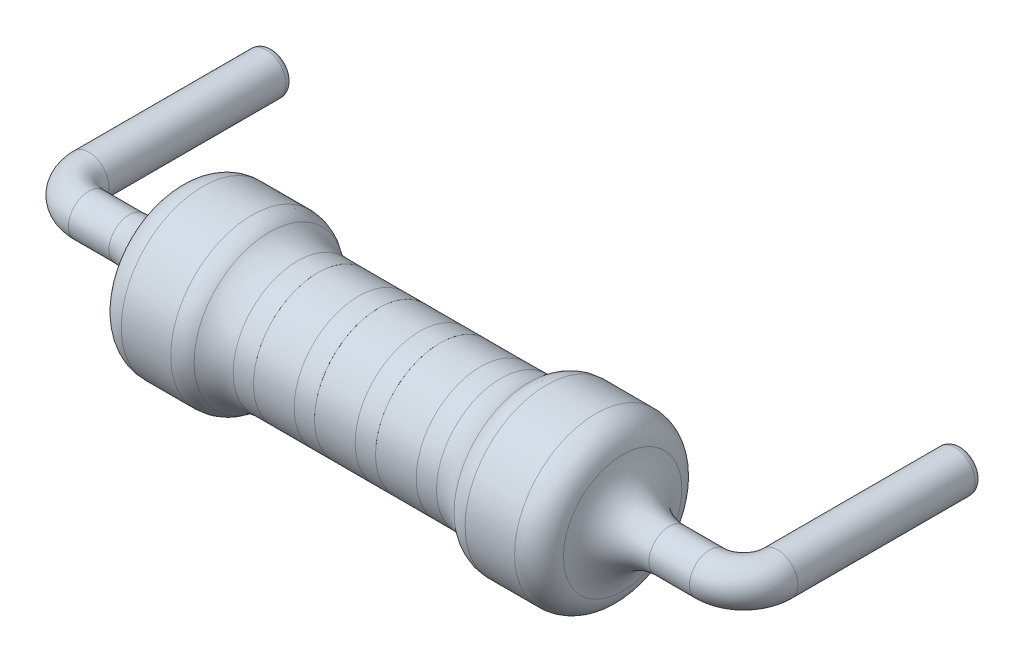
ISO-10303-21;
HEADER;
FILE_DESCRIPTION(('STEP AP214'),'2;1');
FILE_NAME('part.step','',(''),(''),'','','');
FILE_SCHEMA(('AUTOMOTIVE_DESIGN { 1 0 10303 214 1 1 1 1 }'));
ENDSEC;
DATA;
#1=APPLICATION_CONTEXT('core data for automotive mechanical design processes');
#2=APPLICATION_PROTOCOL_DEFINITION('international standard','automotive_design',2000,#1);
#3=PRODUCT_CONTEXT('',#1,'mechanical');
#4=PRODUCT('Part','Part','',(#3));
#5=PRODUCT_RELATED_PRODUCT_CATEGORY('part','',(#4));
#6=PRODUCT_DEFINITION_FORMATION('','',#4);
#7=PRODUCT_DEFINITION_CONTEXT('part definition',#1,'design');
#8=PRODUCT_DEFINITION('design','',#6,#7);
#9=PRODUCT_DEFINITION_SHAPE('','',#8);
#10=(LENGTH_UNIT() NAMED_UNIT(*) SI_UNIT(.MILLI.,.METRE.));
#11=(NAMED_UNIT(*) PLANE_ANGLE_UNIT() SI_UNIT($,.RADIAN.));
#12=(NAMED_UNIT(*) SI_UNIT($,.STERADIAN.) SOLID_ANGLE_UNIT());
#13=UNCERTAINTY_MEASURE_WITH_UNIT(LENGTH_MEASURE(1.E-05),#10,'distance_accuracy_value','');
#14=(GEOMETRIC_REPRESENTATION_CONTEXT(3) GLOBAL_UNCERTAINTY_ASSIGNED_CONTEXT((#13)) GLOBAL_UNIT_ASSIGNED_CONTEXT((#10,
#11,#12)) REPRESENTATION_CONTEXT('',''));
#15=CARTESIAN_POINT('',(0.,0.,0.));
#16=DIRECTION('',(0.,0.,1.));
#17=DIRECTION('',(1.,0.,0.));
#18=AXIS2_PLACEMENT_3D('',#15,#16,#17);
#19=CARTESIAN_POINT('',(5.08,0.,-2.00000000000004));
#20=DIRECTION('',(0.,0.,-1.));
#21=DIRECTION('',(-1.,0.,0.));
#22=AXIS2_PLACEMENT_3D('',#19,#20,#21);
#23=PLANE('',#22);
#24=CARTESIAN_POINT('',(5.08,0.,-2.00000000000004));
#25=DIRECTION('',(0.,0.,1.));
#26=DIRECTION('',(1.,0.,0.));
#27=AXIS2_PLACEMENT_3D('',#24,#25,#26);
#28=CIRCLE('',#27,0.2);
#29=CARTESIAN_POINT('',(5.28,0.,-2.00000000000004));
#30=VERTEX_POINT('',#29);
#31=CARTESIAN_POINT('',(4.88,0.,-2.00000000000003));
#32=VERTEX_POINT('',#31);
#33=EDGE_CURVE('E357',#30,#32,#28,.T.);
#34=ORIENTED_EDGE('',*,*,#33,.F.);
#35=CARTESIAN_POINT('',(5.08,0.,-2.00000000000004));
#36=DIRECTION('',(0.,0.,1.));
#37=DIRECTION('',(-1.,0.,0.));
#38=AXIS2_PLACEMENT_3D('',#35,#36,#37);
#39=CIRCLE('',#38,0.2);
#40=EDGE_CURVE('E367',#32,#30,#39,.T.);
#41=ORIENTED_EDGE('',*,*,#40,.F.);
#42=EDGE_LOOP('',(#34,#41));
#43=FACE_BOUND('',#42,.T.);
#44=ADVANCED_FACE('F17',(#43),#23,.T.);
#45=CARTESIAN_POINT('',(5.08,0.,-1.90000000000004));
#46=DIRECTION('',(0.,0.,-1.));
#47=DIRECTION('',(-1.,0.,0.));
#48=AXIS2_PLACEMENT_3D('',#45,#46,#47);
#49=TOROIDAL_SURFACE('',#48,0.200000000000001,0.1);
#50=ORIENTED_EDGE('',*,*,#40,.T.);
#51=ORIENTED_EDGE('',*,*,#33,.T.);
#52=EDGE_LOOP('',(#50,#51));
#53=FACE_BOUND('',#52,.T.);
#54=CARTESIAN_POINT('',(5.08,0.,-1.90000000000004));
#55=DIRECTION('',(0.,0.,-1.));
#56=DIRECTION('',(-1.,0.,0.));
#57=AXIS2_PLACEMENT_3D('',#54,#55,#56);
#58=CIRCLE('',#57,0.3);
#59=CARTESIAN_POINT('',(4.78,0.,-1.90000000000004));
#60=VERTEX_POINT('',#59);
#61=EDGE_CURVE('E379',#60,#60,#58,.F.);
#62=ORIENTED_EDGE('',*,*,#61,.F.);
#63=EDGE_LOOP('',(#62));
#64=FACE_BOUND('',#63,.T.);
#65=ADVANCED_FACE('F344',(#53,#64),#49,.T.);
#66=CARTESIAN_POINT('',(5.08,0.,0.712999999999925));
#67=DIRECTION('',(0.,0.,-1.));
#68=DIRECTION('',(-1.,0.,0.));
#69=AXIS2_PLACEMENT_3D('',#66,#67,#68);
#70=CYLINDRICAL_SURFACE('',#69,0.3);
#71=ORIENTED_EDGE('',*,*,#61,.T.);
#72=EDGE_LOOP('',(#71));
#73=FACE_BOUND('',#72,.T.);
#74=CARTESIAN_POINT('',(5.08,0.,0.712999999999949));
#75=DIRECTION('',(0.,0.,1.));
#76=DIRECTION('',(1.,0.,0.));
#77=AXIS2_PLACEMENT_3D('',#74,#75,#76);
#78=CIRCLE('',#77,0.3);
#79=CARTESIAN_POINT('',(5.38,0.,0.712999999999922));
#80=VERTEX_POINT('',#79);
#81=EDGE_CURVE('E334',#80,#80,#78,.T.);
#82=ORIENTED_EDGE('',*,*,#81,.F.);
#83=EDGE_LOOP('',(#82));
#84=FACE_BOUND('',#83,.T.);
#85=ADVANCED_FACE('F341',(#73,#84),#70,.T.);
#86=CARTESIAN_POINT('',(4.58,0.,0.712999999999995));
#87=DIRECTION('',(0.,-1.,0.));
#88=DIRECTION('',(0.,0.,-1.));
#89=AXIS2_PLACEMENT_3D('',#86,#87,#88);
#90=TOROIDAL_SURFACE('',#89,0.5,0.3);
#91=ORIENTED_EDGE('',*,*,#81,.T.);
#92=EDGE_LOOP('',(#91));
#93=FACE_BOUND('',#92,.T.);
#94=CARTESIAN_POINT('',(4.57999999999996,0.,1.213));
#95=DIRECTION('',(-1.,0.,0.));
#96=DIRECTION('',(0.,0.,1.));
#97=AXIS2_PLACEMENT_3D('',#94,#95,#96);
#98=CIRCLE('',#97,0.3);
#99=CARTESIAN_POINT('',(4.57999999999996,0.,1.513));
#100=VERTEX_POINT('',#99);
#101=EDGE_CURVE('E330',#100,#100,#98,.T.);
#102=ORIENTED_EDGE('',*,*,#101,.F.);
#103=EDGE_LOOP('',(#102));
#104=FACE_BOUND('',#103,.T.);
#105=ADVANCED_FACE('F338',(#93,#104),#90,.T.);
#106=CARTESIAN_POINT('',(4.58,0.,1.213));
#107=DIRECTION('',(-1.,0.,0.));
#108=DIRECTION('',(0.,0.,1.));
#109=AXIS2_PLACEMENT_3D('',#106,#107,#108);
#110=CYLINDRICAL_SURFACE('',#109,0.3);
#111=CARTESIAN_POINT('',(3.9816653826392,0.,1.213));
#112=DIRECTION('',(1.,0.,0.));
#113=DIRECTION('',(0.,0.,-1.));
#114=AXIS2_PLACEMENT_3D('',#111,#112,#113);
#115=CIRCLE('',#114,0.3);
#116=CARTESIAN_POINT('',(3.9816653826392,0.,0.912999999999996));
#117=VERTEX_POINT('',#116);
#118=EDGE_CURVE('E326',#117,#117,#115,.T.);
#119=ORIENTED_EDGE('',*,*,#118,.T.);
#120=EDGE_LOOP('',(#119));
#121=FACE_BOUND('',#120,.T.);
#122=ORIENTED_EDGE('',*,*,#101,.T.);
#123=EDGE_LOOP('',(#122));
#124=FACE_BOUND('',#123,.T.);
#125=ADVANCED_FACE('F321',(#121,#124),#110,.T.);
#126=CARTESIAN_POINT('',(3.9816653826392,0.,1.213));
#127=DIRECTION('',(1.,0.,0.));
#128=DIRECTION('',(0.,0.,-1.));
#129=AXIS2_PLACEMENT_3D('',#126,#127,#128);
#130=TOROIDAL_SURFACE('',#129,1.,0.7);
#131=CARTESIAN_POINT('',(3.29333286641425,0.,1.213));
#132=DIRECTION('',(1.,0.,0.));
#133=DIRECTION('',(0.,0.,-1.));
#134=AXIS2_PLACEMENT_3D('',#131,#132,#133);
#135=CIRCLE('',#134,0.872727272727279);
#136=CARTESIAN_POINT('',(3.29333286641425,0.,0.340272727272717));
#137=VERTEX_POINT('',#136);
#138=EDGE_CURVE('E308',#137,#137,#135,.F.);
#139=ORIENTED_EDGE('',*,*,#138,.F.);
#140=EDGE_LOOP('',(#139));
#141=FACE_BOUND('',#140,.T.);
#142=ORIENTED_EDGE('',*,*,#118,.F.);
#143=EDGE_LOOP('',(#142));
#144=FACE_BOUND('',#143,.T.);
#145=ADVANCED_FACE('F317',(#141,#144),#130,.F.);
#146=CARTESIAN_POINT('',(2.9,0.,1.213));
#147=DIRECTION('',(1.,0.,0.));
#148=DIRECTION('',(0.,0.,-1.));
#149=AXIS2_PLACEMENT_3D('',#146,#147,#148);
#150=TOROIDAL_SURFACE('',#149,0.8,0.4);
#151=ORIENTED_EDGE('',*,*,#138,.T.);
#152=EDGE_LOOP('',(#151));
#153=FACE_BOUND('',#152,.T.);
#154=CARTESIAN_POINT('',(2.9,0.,1.213));
#155=DIRECTION('',(-1.,0.,0.));
#156=DIRECTION('',(0.,0.,1.));
#157=AXIS2_PLACEMENT_3D('',#154,#155,#156);
#158=CIRCLE('',#157,1.2);
#159=CARTESIAN_POINT('',(2.9,0.,2.413));
#160=VERTEX_POINT('',#159);
#161=EDGE_CURVE('E304',#160,#160,#158,.T.);
#162=ORIENTED_EDGE('',*,*,#161,.F.);
#163=EDGE_LOOP('',(#162));
#164=FACE_BOUND('',#163,.T.);
#165=ADVANCED_FACE('F313',(#153,#164),#150,.T.);
#166=CARTESIAN_POINT('',(3.3,0.,1.213));
#167=DIRECTION('',(-1.,0.,0.));
#168=DIRECTION('',(0.,0.,1.));
#169=AXIS2_PLACEMENT_3D('',#166,#167,#168);
#170=CYLINDRICAL_SURFACE('',#169,1.2);
#171=ORIENTED_EDGE('',*,*,#161,.T.);
#172=EDGE_LOOP('',(#171));
#173=FACE_BOUND('',#172,.T.);
#174=CARTESIAN_POINT('',(2.17080992435478,0.,1.213));
#175=DIRECTION('',(-1.,0.,0.));
#176=DIRECTION('',(0.,0.,1.));
#177=AXIS2_PLACEMENT_3D('',#174,#175,#176);
#178=CIRCLE('',#177,1.2);
#179=CARTESIAN_POINT('',(2.17080992435478,0.,2.413));
#180=VERTEX_POINT('',#179);
#181=EDGE_CURVE('E298',#180,#180,#178,.T.);
#182=ORIENTED_EDGE('',*,*,#181,.F.);
#183=EDGE_LOOP('',(#182));
#184=FACE_BOUND('',#183,.T.);
#185=ADVANCED_FACE('F316',(#173,#184),#170,.T.);
#186=CARTESIAN_POINT('',(2.17080992435478,0.,1.213));
#187=DIRECTION('',(-1.,0.,0.));
#188=DIRECTION('',(0.,0.,1.));
#189=AXIS2_PLACEMENT_3D('',#186,#187,#188);
#190=TOROIDAL_SURFACE('',#189,0.8,0.4);
#191=ORIENTED_EDGE('',*,*,#181,.T.);
#192=EDGE_LOOP('',(#191));
#193=FACE_BOUND('',#192,.T.);
#194=CARTESIAN_POINT('',(1.91691465083171,0.,1.213));
#195=DIRECTION('',(-1.,0.,0.));
#196=DIRECTION('',(0.,0.,1.));
#197=AXIS2_PLACEMENT_3D('',#194,#195,#196);
#198=CIRCLE('',#197,1.10909090909091);
#199=CARTESIAN_POINT('',(1.91691465083171,0.,2.3220909090909));
#200=VERTEX_POINT('',#199);
#201=EDGE_CURVE('E294',#200,#200,#198,.F.);
#202=ORIENTED_EDGE('',*,*,#201,.T.);
#203=EDGE_LOOP('',(#202));
#204=FACE_BOUND('',#203,.T.);
#205=ADVANCED_FACE('F284',(#193,#204),#190,.T.);
#206=CARTESIAN_POINT('',(1.47259792216634,0.,1.213));
#207=DIRECTION('',(-1.,0.,0.));
#208=DIRECTION('',(0.,0.,1.));
#209=AXIS2_PLACEMENT_3D('',#206,#207,#208);
#210=TOROIDAL_SURFACE('',#209,1.65,0.7);
#211=ORIENTED_EDGE('',*,*,#201,.F.);
#212=EDGE_LOOP('',(#211));
#213=FACE_BOUND('',#212,.T.);
#214=CARTESIAN_POINT('',(1.49905071029915,0.,1.213));
#215=DIRECTION('',(-1.,0.,0.));
#216=DIRECTION('',(0.,0.,1.));
#217=AXIS2_PLACEMENT_3D('',#214,#215,#216);
#218=CIRCLE('',#217,0.9505);
#219=CARTESIAN_POINT('',(1.49905071029915,0.,2.1635));
#220=VERTEX_POINT('',#219);
#221=EDGE_CURVE('E297',#220,#220,#218,.T.);
#222=ORIENTED_EDGE('',*,*,#221,.F.);
#223=EDGE_LOOP('',(#222));
#224=FACE_BOUND('',#223,.T.);
#225=ADVANCED_FACE('F279',(#213,#224),#210,.F.);
#226=CARTESIAN_POINT('',(1.5,0.,1.213));
#227=DIRECTION('',(-1.,0.,0.));
#228=DIRECTION('',(0.,0.,1.));
#229=AXIS2_PLACEMENT_3D('',#226,#227,#228);
#230=CYLINDRICAL_SURFACE('',#229,0.9505);
#231=ORIENTED_EDGE('',*,*,#221,.T.);
#232=EDGE_LOOP('',(#231));
#233=FACE_BOUND('',#232,.T.);
#234=CARTESIAN_POINT('',(1.2,0.,1.213));
#235=DIRECTION('',(-1.,0.,0.));
#236=DIRECTION('',(0.,0.,1.));
#237=AXIS2_PLACEMENT_3D('',#234,#235,#236);
#238=CIRCLE('',#237,0.9505);
#239=CARTESIAN_POINT('',(1.2,0.,0.262749999999996));
#240=VERTEX_POINT('',#239);
#241=CARTESIAN_POINT('',(1.2,0.,2.16325));
#242=VERTEX_POINT('',#241);
#243=EDGE_CURVE('E391',#240,#242,#238,.F.);
#244=ORIENTED_EDGE('',*,*,#243,.T.);
#245=CARTESIAN_POINT('',(1.2,0.,1.213));
#246=DIRECTION('',(1.,0.,0.));
#247=DIRECTION('',(0.,0.,1.));
#248=AXIS2_PLACEMENT_3D('',#245,#246,#247);
#249=CIRCLE('',#248,0.9505);
#250=EDGE_CURVE('E487',#242,#240,#249,.T.);
#251=ORIENTED_EDGE('',*,*,#250,.T.);
#252=EDGE_LOOP('',(#244,#251));
#253=FACE_BOUND('',#252,.T.);
#254=ADVANCED_FACE('F270',(#233,#253),#230,.T.);
#255=CARTESIAN_POINT('',(1.2,0.,1.213));
#256=DIRECTION('',(1.,0.,0.));
#257=DIRECTION('',(0.,0.,-1.));
#258=AXIS2_PLACEMENT_3D('',#255,#256,#257);
#259=PLANE('',#258);
#260=ORIENTED_EDGE('',*,*,#243,.F.);
#261=CARTESIAN_POINT('',(1.2,0.,1.213));
#262=DIRECTION('',(-1.,0.,0.));
#263=DIRECTION('',(0.,0.,1.));
#264=AXIS2_PLACEMENT_3D('',#261,#262,#263);
#265=CIRCLE('',#264,0.95);
#266=EDGE_CURVE('E456',#242,#240,#265,.T.);
#267=ORIENTED_EDGE('',*,*,#266,.F.);
#268=EDGE_LOOP('',(#260,#267));
#269=FACE_BOUND('',#268,.T.);
#270=ADVANCED_FACE('F249',(#269),#259,.F.);
#271=CARTESIAN_POINT('',(4.48700576850888,0.,1.213));
#272=DIRECTION('',(-1.,0.,0.));
#273=DIRECTION('',(0.,0.,1.));
#274=AXIS2_PLACEMENT_3D('',#271,#272,#273);
#275=CYLINDRICAL_SURFACE('',#274,0.95);
#276=ORIENTED_EDGE('',*,*,#266,.T.);
#277=ORIENTED_EDGE('',*,*,#250,.F.);
#278=EDGE_LOOP('',(#276,#277));
#279=FACE_BOUND('',#278,.T.);
#280=CARTESIAN_POINT('',(0.6,0.,1.213));
#281=DIRECTION('',(-1.,0.,0.));
#282=DIRECTION('',(0.,0.,1.));
#283=AXIS2_PLACEMENT_3D('',#280,#281,#282);
#284=CIRCLE('',#283,0.95);
#285=CARTESIAN_POINT('',(0.6,0.,2.16325));
#286=VERTEX_POINT('',#285);
#287=CARTESIAN_POINT('',(0.6,0.,0.262749999999996));
#288=VERTEX_POINT('',#287);
#289=EDGE_CURVE('E450',#286,#288,#284,.T.);
#290=ORIENTED_EDGE('',*,*,#289,.F.);
#291=CARTESIAN_POINT('',(0.6,0.,1.213));
#292=DIRECTION('',(1.,0.,0.));
#293=DIRECTION('',(0.,0.,1.));
#294=AXIS2_PLACEMENT_3D('',#291,#292,#293);
#295=CIRCLE('',#294,0.95);
#296=EDGE_CURVE('E264',#286,#288,#295,.T.);
#297=ORIENTED_EDGE('',*,*,#296,.T.);
#298=EDGE_LOOP('',(#290,#297));
#299=FACE_BOUND('',#298,.T.);
#300=ADVANCED_FACE('F240',(#279,#299),#275,.T.);
#301=CARTESIAN_POINT('',(0.6,0.,1.213));
#302=DIRECTION('',(1.,0.,0.));
#303=DIRECTION('',(0.,0.,-1.));
#304=AXIS2_PLACEMENT_3D('',#301,#302,#303);
#305=PLANE('',#304);
#306=CARTESIAN_POINT('',(0.6,0.,1.213));
#307=DIRECTION('',(-1.,0.,0.));
#308=DIRECTION('',(0.,0.,1.));
#309=AXIS2_PLACEMENT_3D('',#306,#307,#308);
#310=CIRCLE('',#309,0.9505);
#311=EDGE_CURVE('E445',#286,#288,#310,.T.);
#312=ORIENTED_EDGE('',*,*,#311,.F.);
#313=ORIENTED_EDGE('',*,*,#289,.T.);
#314=EDGE_LOOP('',(#312,#313));
#315=FACE_BOUND('',#314,.T.);
#316=ADVANCED_FACE('F218',(#315),#305,.T.);
#317=CARTESIAN_POINT('',(0.6,0.,1.213));
#318=DIRECTION('',(-1.,0.,0.));
#319=DIRECTION('',(0.,0.,1.));
#320=AXIS2_PLACEMENT_3D('',#317,#318,#319);
#321=CYLINDRICAL_SURFACE('',#320,0.9505);
#322=ORIENTED_EDGE('',*,*,#311,.T.);
#323=ORIENTED_EDGE('',*,*,#296,.F.);
#324=EDGE_LOOP('',(#322,#323));
#325=FACE_BOUND('',#324,.T.);
#326=CARTESIAN_POINT('',(0.3,0.,1.213));
#327=DIRECTION('',(-1.,0.,0.));
#328=DIRECTION('',(0.,0.,1.));
#329=AXIS2_PLACEMENT_3D('',#326,#327,#328);
#330=CIRCLE('',#329,0.9505);
#331=CARTESIAN_POINT('',(0.3,0.,0.262749999999996));
#332=VERTEX_POINT('',#331);
#333=CARTESIAN_POINT('',(0.3,0.,2.16325));
#334=VERTEX_POINT('',#333);
#335=EDGE_CURVE('E440',#332,#334,#330,.F.);
#336=ORIENTED_EDGE('',*,*,#335,.T.);
#337=CARTESIAN_POINT('',(0.3,0.,1.213));
#338=DIRECTION('',(1.,0.,0.));
#339=DIRECTION('',(0.,0.,1.));
#340=AXIS2_PLACEMENT_3D('',#337,#338,#339);
#341=CIRCLE('',#340,0.9505);
#342=EDGE_CURVE('E234',#334,#332,#341,.T.);
#343=ORIENTED_EDGE('',*,*,#342,.T.);
#344=EDGE_LOOP('',(#336,#343));
#345=FACE_BOUND('',#344,.T.);
#346=ADVANCED_FACE('F209',(#325,#345),#321,.T.);
#347=CARTESIAN_POINT('',(0.3,0.,1.213));
#348=DIRECTION('',(1.,0.,0.));
#349=DIRECTION('',(0.,0.,-1.));
#350=AXIS2_PLACEMENT_3D('',#347,#348,#349);
#351=PLANE('',#350);
#352=ORIENTED_EDGE('',*,*,#335,.F.);
#353=CARTESIAN_POINT('',(0.3,0.,1.213));
#354=DIRECTION('',(-1.,0.,0.));
#355=DIRECTION('',(0.,0.,1.));
#356=AXIS2_PLACEMENT_3D('',#353,#354,#355);
#357=CIRCLE('',#356,0.95);
#358=EDGE_CURVE('E435',#334,#332,#357,.T.);
#359=ORIENTED_EDGE('',*,*,#358,.F.);
#360=EDGE_LOOP('',(#352,#359));
#361=FACE_BOUND('',#360,.T.);
#362=ADVANCED_FACE('F189',(#361),#351,.F.);
#363=CARTESIAN_POINT('',(4.48700576850888,0.,1.213));
#364=DIRECTION('',(-1.,0.,0.));
#365=DIRECTION('',(0.,0.,1.));
#366=AXIS2_PLACEMENT_3D('',#363,#364,#365);
#367=CYLINDRICAL_SURFACE('',#366,0.95);
#368=ORIENTED_EDGE('',*,*,#358,.T.);
#369=ORIENTED_EDGE('',*,*,#342,.F.);
#370=EDGE_LOOP('',(#368,#369));
#371=FACE_BOUND('',#370,.T.);
#372=CARTESIAN_POINT('',(-0.3,0.,1.213));
#373=DIRECTION('',(-1.,0.,0.));
#374=DIRECTION('',(0.,0.,1.));
#375=AXIS2_PLACEMENT_3D('',#372,#373,#374);
#376=CIRCLE('',#375,0.95);
#377=CARTESIAN_POINT('',(-0.3,0.,2.16325));
#378=VERTEX_POINT('',#377);
#379=CARTESIAN_POINT('',(-0.3,0.,0.262749999999996));
#380=VERTEX_POINT('',#379);
#381=EDGE_CURVE('E432',#378,#380,#376,.T.);
#382=ORIENTED_EDGE('',*,*,#381,.F.);
#383=CARTESIAN_POINT('',(-0.3,0.,1.213));
#384=DIRECTION('',(1.,0.,0.));
#385=DIRECTION('',(0.,0.,1.));
#386=AXIS2_PLACEMENT_3D('',#383,#384,#385);
#387=CIRCLE('',#386,0.95);
#388=EDGE_CURVE('E172',#378,#380,#387,.T.);
#389=ORIENTED_EDGE('',*,*,#388,.T.);
#390=EDGE_LOOP('',(#382,#389));
#391=FACE_BOUND('',#390,.T.);
#392=ADVANCED_FACE('F179',(#371,#391),#367,.T.);
#393=CARTESIAN_POINT('',(-0.3,0.,1.213));
#394=DIRECTION('',(1.,0.,0.));
#395=DIRECTION('',(0.,0.,-1.));
#396=AXIS2_PLACEMENT_3D('',#393,#394,#395);
#397=PLANE('',#396);
#398=ORIENTED_EDGE('',*,*,#381,.T.);
#399=CARTESIAN_POINT('',(-0.3,0.,1.213));
#400=DIRECTION('',(1.,0.,0.));
#401=DIRECTION('',(0.,0.,-1.));
#402=AXIS2_PLACEMENT_3D('',#399,#400,#401);
#403=CIRCLE('',#402,0.9505);
#404=EDGE_CURVE('E427',#378,#380,#403,.F.);
#405=ORIENTED_EDGE('',*,*,#404,.F.);
#406=EDGE_LOOP('',(#398,#405));
#407=FACE_BOUND('',#406,.T.);
#408=ADVANCED_FACE('F188',(#407),#397,.T.);
#409=CARTESIAN_POINT('',(-5.08,0.,-1.99999999999996));
#410=DIRECTION('',(-1.33226762955019E-13,0.,1.));
#411=DIRECTION('',(1.,0.,1.33226762955019E-13));
#412=AXIS2_PLACEMENT_3D('',#409,#410,#411);
#413=PLANE('',#412);
#414=CARTESIAN_POINT('',(-5.07999999999999,0.,-1.99999999999996));
#415=DIRECTION('',(-1.33226762955019E-13,0.,1.));
#416=DIRECTION('',(1.,0.,1.32272665043232E-13));
#417=AXIS2_PLACEMENT_3D('',#414,#415,#416);
#418=CIRCLE('',#417,0.2);
#419=CARTESIAN_POINT('',(-4.87999999999999,0.,-1.99999999999994));
#420=VERTEX_POINT('',#419);
#421=CARTESIAN_POINT('',(-5.27999999999999,0.,-1.99999999999999));
#422=VERTEX_POINT('',#421);
#423=EDGE_CURVE('E424',#420,#422,#418,.T.);
#424=ORIENTED_EDGE('',*,*,#423,.F.);
#425=CARTESIAN_POINT('',(-5.07999999999999,0.,-1.99999999999996));
#426=DIRECTION('',(-1.33226762955019E-13,0.,1.));
#427=DIRECTION('',(-1.,0.,-1.32272665043232E-13));
#428=AXIS2_PLACEMENT_3D('',#425,#426,#427);
#429=CIRCLE('',#428,0.2);
#430=EDGE_CURVE('E38',#422,#420,#429,.T.);
#431=ORIENTED_EDGE('',*,*,#430,.F.);
#432=EDGE_LOOP('',(#424,#431));
#433=FACE_BOUND('',#432,.T.);
#434=ADVANCED_FACE('F152',(#433),#413,.F.);
#435=CARTESIAN_POINT('',(-0.6,0.,1.213));
#436=DIRECTION('',(1.,0.,0.));
#437=DIRECTION('',(0.,0.,-1.));
#438=AXIS2_PLACEMENT_3D('',#435,#436,#437);
#439=CYLINDRICAL_SURFACE('',#438,0.9505);
#440=CARTESIAN_POINT('',(-0.6,0.,1.213));
#441=DIRECTION('',(1.,0.,0.));
#442=DIRECTION('',(0.,0.,-1.));
#443=AXIS2_PLACEMENT_3D('',#440,#441,#442);
#444=CIRCLE('',#443,0.9505);
#445=CARTESIAN_POINT('',(-0.6,0.,0.262749999999996));
#446=VERTEX_POINT('',#445);
#447=CARTESIAN_POINT('',(-0.6,0.,2.16325));
#448=VERTEX_POINT('',#447);
#449=EDGE_CURVE('E420',#446,#448,#444,.T.);
#450=ORIENTED_EDGE('',*,*,#449,.T.);
#451=CARTESIAN_POINT('',(-0.6,0.,1.213));
#452=DIRECTION('',(1.,0.,0.));
#453=DIRECTION('',(0.,0.,1.));
#454=AXIS2_PLACEMENT_3D('',#451,#452,#453);
#455=CIRCLE('',#454,0.9505);
#456=EDGE_CURVE('E103',#448,#446,#455,.T.);
#457=ORIENTED_EDGE('',*,*,#456,.T.);
#458=EDGE_LOOP('',(#450,#457));
#459=FACE_BOUND('',#458,.T.);
#460=ORIENTED_EDGE('',*,*,#404,.T.);
#461=ORIENTED_EDGE('',*,*,#388,.F.);
#462=EDGE_LOOP('',(#460,#461));
#463=FACE_BOUND('',#462,.T.);
#464=ADVANCED_FACE('F141',(#459,#463),#439,.T.);
#465=CARTESIAN_POINT('',(-5.08,0.,-1.89999999999997));
#466=DIRECTION('',(-1.33226762955019E-13,0.,1.));
#467=DIRECTION('',(1.,0.,1.33226762955019E-13));
#468=AXIS2_PLACEMENT_3D('',#465,#466,#467);
#469=TOROIDAL_SURFACE('',#468,0.200000000000001,0.1);
#470=CARTESIAN_POINT('',(-5.08,0.,-1.89999999999994));
#471=DIRECTION('',(0.,0.,-1.));
#472=DIRECTION('',(-1.,0.,0.));
#473=AXIS2_PLACEMENT_3D('',#470,#471,#472);
#474=CIRCLE('',#473,0.3);
#475=CARTESIAN_POINT('',(-5.38,0.,-1.89999999999994));
#476=VERTEX_POINT('',#475);
#477=EDGE_CURVE('E417',#476,#476,#474,.F.);
#478=ORIENTED_EDGE('',*,*,#477,.F.);
#479=EDGE_LOOP('',(#478));
#480=FACE_BOUND('',#479,.T.);
#481=ORIENTED_EDGE('',*,*,#423,.T.);
#482=ORIENTED_EDGE('',*,*,#430,.T.);
#483=EDGE_LOOP('',(#481,#482));
#484=FACE_BOUND('',#483,.T.);
#485=ADVANCED_FACE('F151',(#480,#484),#469,.T.);
#486=CARTESIAN_POINT('',(-0.6,0.,1.213));
#487=DIRECTION('',(1.,0.,0.));
#488=DIRECTION('',(0.,0.,-1.));
#489=AXIS2_PLACEMENT_3D('',#486,#487,#488);
#490=PLANE('',#489);
#491=CARTESIAN_POINT('',(-0.6,0.,1.213));
#492=DIRECTION('',(-1.,0.,0.));
#493=DIRECTION('',(0.,0.,1.));
#494=AXIS2_PLACEMENT_3D('',#491,#492,#493);
#495=CIRCLE('',#494,0.95);
#496=EDGE_CURVE('E414',#448,#446,#495,.T.);
#497=ORIENTED_EDGE('',*,*,#496,.F.);
#498=ORIENTED_EDGE('',*,*,#449,.F.);
#499=EDGE_LOOP('',(#497,#498));
#500=FACE_BOUND('',#499,.T.);
#501=ADVANCED_FACE('F503',(#500),#490,.F.);
#502=CARTESIAN_POINT('',(-5.08,0.,0.712999999999996));
#503=DIRECTION('',(0.,0.,-1.));
#504=DIRECTION('',(-1.,0.,0.));
#505=AXIS2_PLACEMENT_3D('',#502,#503,#504);
#506=CYLINDRICAL_SURFACE('',#505,0.3);
#507=ORIENTED_EDGE('',*,*,#477,.T.);
#508=EDGE_LOOP('',(#507));
#509=FACE_BOUND('',#508,.T.);
#510=CARTESIAN_POINT('',(-5.08,0.,0.713000000000096));
#511=DIRECTION('',(-1.991356630327E-13,0.,-1.));
#512=DIRECTION('',(-1.,0.,1.991356630327E-13));
#513=AXIS2_PLACEMENT_3D('',#510,#511,#512);
#514=CIRCLE('',#513,0.3);
#515=CARTESIAN_POINT('',(-5.38,0.,0.713000000000155));
#516=VERTEX_POINT('',#515);
#517=EDGE_CURVE('E99',#516,#516,#514,.F.);
#518=ORIENTED_EDGE('',*,*,#517,.F.);
#519=EDGE_LOOP('',(#518));
#520=FACE_BOUND('',#519,.T.);
#521=ADVANCED_FACE('F121',(#509,#520),#506,.T.);
#522=CARTESIAN_POINT('',(4.48700576850888,0.,1.213));
#523=DIRECTION('',(-1.,0.,0.));
#524=DIRECTION('',(0.,0.,1.));
#525=AXIS2_PLACEMENT_3D('',#522,#523,#524);
#526=CYLINDRICAL_SURFACE('',#525,0.95);
#527=ORIENTED_EDGE('',*,*,#496,.T.);
#528=ORIENTED_EDGE('',*,*,#456,.F.);
#529=EDGE_LOOP('',(#527,#528));
#530=FACE_BOUND('',#529,.T.);
#531=CARTESIAN_POINT('',(-1.2,0.,1.213));
#532=DIRECTION('',(-1.,0.,0.));
#533=DIRECTION('',(0.,0.,1.));
#534=AXIS2_PLACEMENT_3D('',#531,#532,#533);
#535=CIRCLE('',#534,0.95);
#536=CARTESIAN_POINT('',(-1.2,0.,2.16325));
#537=VERTEX_POINT('',#536);
#538=CARTESIAN_POINT('',(-1.2,0.,0.262749999999996));
#539=VERTEX_POINT('',#538);
#540=EDGE_CURVE('E83',#537,#539,#535,.T.);
#541=ORIENTED_EDGE('',*,*,#540,.F.);
#542=CARTESIAN_POINT('',(-1.2,0.,1.213));
#543=DIRECTION('',(1.,0.,0.));
#544=DIRECTION('',(0.,0.,1.));
#545=AXIS2_PLACEMENT_3D('',#542,#543,#544);
#546=CIRCLE('',#545,0.95);
#547=EDGE_CURVE('E96',#537,#539,#546,.T.);
#548=ORIENTED_EDGE('',*,*,#547,.T.);
#549=EDGE_LOOP('',(#541,#548));
#550=FACE_BOUND('',#549,.T.);
#551=ADVANCED_FACE('F95',(#530,#550),#526,.T.);
#552=CARTESIAN_POINT('',(-4.58,0.,0.712999999999996));
#553=DIRECTION('',(0.,-1.,0.));
#554=DIRECTION('',(0.,0.,-1.));
#555=AXIS2_PLACEMENT_3D('',#552,#553,#554);
#556=TOROIDAL_SURFACE('',#555,0.500000000000001,0.3);
#557=CARTESIAN_POINT('',(-4.57999999999996,0.,1.213));
#558=DIRECTION('',(-1.,0.,0.));
#559=DIRECTION('',(0.,0.,1.));
#560=AXIS2_PLACEMENT_3D('',#557,#558,#559);
#561=CIRCLE('',#560,0.3);
#562=CARTESIAN_POINT('',(-4.57999999999996,0.,1.513));
#563=VERTEX_POINT('',#562);
#564=EDGE_CURVE('E92',#563,#563,#561,.F.);
#565=ORIENTED_EDGE('',*,*,#564,.F.);
#566=EDGE_LOOP('',(#565));
#567=FACE_BOUND('',#566,.T.);
#568=ORIENTED_EDGE('',*,*,#517,.T.);
#569=EDGE_LOOP('',(#568));
#570=FACE_BOUND('',#569,.T.);
#571=ADVANCED_FACE('F120',(#567,#570),#556,.T.);
#572=CARTESIAN_POINT('',(-1.2,0.,1.213));
#573=DIRECTION('',(1.,0.,0.));
#574=DIRECTION('',(0.,0.,-1.));
#575=AXIS2_PLACEMENT_3D('',#572,#573,#574);
#576=PLANE('',#575);
#577=ORIENTED_EDGE('',*,*,#540,.T.);
#578=CARTESIAN_POINT('',(-1.2,0.,1.213));
#579=DIRECTION('',(1.,0.,0.));
#580=DIRECTION('',(0.,0.,-1.));
#581=AXIS2_PLACEMENT_3D('',#578,#579,#580);
#582=CIRCLE('',#581,0.9505);
#583=EDGE_CURVE('E85',#537,#539,#582,.F.);
#584=ORIENTED_EDGE('',*,*,#583,.F.);
#585=EDGE_LOOP('',(#577,#584));
#586=FACE_BOUND('',#585,.T.);
#587=ADVANCED_FACE('F86',(#586),#576,.T.);
#588=CARTESIAN_POINT('',(4.58,0.,1.213));
#589=DIRECTION('',(-1.,0.,0.));
#590=DIRECTION('',(0.,0.,1.));
#591=AXIS2_PLACEMENT_3D('',#588,#589,#590);
#592=CYLINDRICAL_SURFACE('',#591,0.3);
#593=ORIENTED_EDGE('',*,*,#564,.T.);
#594=EDGE_LOOP('',(#593));
#595=FACE_BOUND('',#594,.T.);
#596=CARTESIAN_POINT('',(-3.9816653826392,0.,1.213));
#597=DIRECTION('',(1.,0.,0.));
#598=DIRECTION('',(0.,0.,-1.));
#599=AXIS2_PLACEMENT_3D('',#596,#597,#598);
#600=CIRCLE('',#599,0.3);
#601=CARTESIAN_POINT('',(-3.9816653826392,0.,0.912999999999996));
#602=VERTEX_POINT('',#601);
#603=EDGE_CURVE('E91',#602,#602,#600,.F.);
#604=ORIENTED_EDGE('',*,*,#603,.T.);
#605=EDGE_LOOP('',(#604));
#606=FACE_BOUND('',#605,.T.);
#607=ADVANCED_FACE('F543',(#595,#606),#592,.T.);
#608=CARTESIAN_POINT('',(-1.5,0.,1.213));
#609=DIRECTION('',(1.,0.,0.));
#610=DIRECTION('',(0.,0.,-1.));
#611=AXIS2_PLACEMENT_3D('',#608,#609,#610);
#612=CYLINDRICAL_SURFACE('',#611,0.9505);
#613=CARTESIAN_POINT('',(-1.49905071029915,0.,1.213));
#614=DIRECTION('',(-1.,0.,0.));
#615=DIRECTION('',(0.,0.,1.));
#616=AXIS2_PLACEMENT_3D('',#613,#614,#615);
#617=CIRCLE('',#616,0.9505);
#618=CARTESIAN_POINT('',(-1.49905071029915,0.,2.1635));
#619=VERTEX_POINT('',#618);
#620=EDGE_CURVE('E392',#619,#619,#617,.F.);
#621=ORIENTED_EDGE('',*,*,#620,.T.);
#622=EDGE_LOOP('',(#621));
#623=FACE_BOUND('',#622,.T.);
#624=ORIENTED_EDGE('',*,*,#583,.T.);
#625=ORIENTED_EDGE('',*,*,#547,.F.);
#626=EDGE_LOOP('',(#624,#625));
#627=FACE_BOUND('',#626,.T.);
#628=ADVANCED_FACE('F101',(#623,#627),#612,.T.);
#629=CARTESIAN_POINT('',(-3.9816653826392,0.,1.213));
#630=DIRECTION('',(1.,0.,0.));
#631=DIRECTION('',(0.,0.,-1.));
#632=AXIS2_PLACEMENT_3D('',#629,#630,#631);
#633=TOROIDAL_SURFACE('',#632,1.,0.7);
#634=ORIENTED_EDGE('',*,*,#603,.F.);
#635=EDGE_LOOP('',(#634));
#636=FACE_BOUND('',#635,.T.);
#637=CARTESIAN_POINT('',(-3.29333286641425,0.,1.213));
#638=DIRECTION('',(1.,0.,0.));
#639=DIRECTION('',(0.,0.,-1.));
#640=AXIS2_PLACEMENT_3D('',#637,#638,#639);
#641=CIRCLE('',#640,0.872727272727281);
#642=CARTESIAN_POINT('',(-3.29333286641425,0.,0.340272727272715));
#643=VERTEX_POINT('',#642);
#644=EDGE_CURVE('E396',#643,#643,#641,.T.);
#645=ORIENTED_EDGE('',*,*,#644,.F.);
#646=EDGE_LOOP('',(#645));
#647=FACE_BOUND('',#646,.T.);
#648=ADVANCED_FACE('F536',(#636,#647),#633,.F.);
#649=CARTESIAN_POINT('',(-1.47259792216634,0.,1.213));
#650=DIRECTION('',(-1.,0.,0.));
#651=DIRECTION('',(0.,0.,1.));
#652=AXIS2_PLACEMENT_3D('',#649,#650,#651);
#653=TOROIDAL_SURFACE('',#652,1.65,0.7);
#654=ORIENTED_EDGE('',*,*,#620,.F.);
#655=EDGE_LOOP('',(#654));
#656=FACE_BOUND('',#655,.T.);
#657=CARTESIAN_POINT('',(-1.91691465083171,0.,1.213));
#658=DIRECTION('',(1.,0.,0.));
#659=DIRECTION('',(0.,0.,-1.));
#660=AXIS2_PLACEMENT_3D('',#657,#658,#659);
#661=CIRCLE('',#660,1.10909090909091);
#662=CARTESIAN_POINT('',(-1.91691465083171,0.,0.103909090909087));
#663=VERTEX_POINT('',#662);
#664=EDGE_CURVE('E397',#663,#663,#661,.F.);
#665=ORIENTED_EDGE('',*,*,#664,.F.);
#666=EDGE_LOOP('',(#665));
#667=FACE_BOUND('',#666,.T.);
#668=ADVANCED_FACE('F533',(#656,#667),#653,.F.);
#669=CARTESIAN_POINT('',(-2.9,0.,1.213));
#670=DIRECTION('',(1.,0.,0.));
#671=DIRECTION('',(0.,0.,-1.));
#672=AXIS2_PLACEMENT_3D('',#669,#670,#671);
#673=TOROIDAL_SURFACE('',#672,0.8,0.4);
#674=ORIENTED_EDGE('',*,*,#644,.T.);
#675=EDGE_LOOP('',(#674));
#676=FACE_BOUND('',#675,.T.);
#677=CARTESIAN_POINT('',(-2.9,0.,1.213));
#678=DIRECTION('',(1.,0.,0.));
#679=DIRECTION('',(0.,0.,-1.));
#680=AXIS2_PLACEMENT_3D('',#677,#678,#679);
#681=CIRCLE('',#680,1.2);
#682=CARTESIAN_POINT('',(-2.9,0.,0.0129999999999961));
#683=VERTEX_POINT('',#682);
#684=EDGE_CURVE('E30',#683,#683,#681,.T.);
#685=ORIENTED_EDGE('',*,*,#684,.F.);
#686=EDGE_LOOP('',(#685));
#687=FACE_BOUND('',#686,.T.);
#688=ADVANCED_FACE('F518',(#676,#687),#673,.T.);
#689=CARTESIAN_POINT('',(-2.17080992435478,0.,1.213));
#690=DIRECTION('',(1.,0.,0.));
#691=DIRECTION('',(0.,0.,-1.));
#692=AXIS2_PLACEMENT_3D('',#689,#690,#691);
#693=TOROIDAL_SURFACE('',#692,0.8,0.4);
#694=CARTESIAN_POINT('',(-2.17080992435478,0.,1.213));
#695=DIRECTION('',(1.,0.,0.));
#696=DIRECTION('',(0.,0.,-1.));
#697=AXIS2_PLACEMENT_3D('',#694,#695,#696);
#698=CIRCLE('',#697,1.2);
#699=CARTESIAN_POINT('',(-2.17080992435478,0.,0.0129999999999961));
#700=VERTEX_POINT('',#699);
#701=EDGE_CURVE('E11',#700,#700,#698,.F.);
#702=ORIENTED_EDGE('',*,*,#701,.F.);
#703=EDGE_LOOP('',(#702));
#704=FACE_BOUND('',#703,.T.);
#705=ORIENTED_EDGE('',*,*,#664,.T.);
#706=EDGE_LOOP('',(#705));
#707=FACE_BOUND('',#706,.T.);
#708=ADVANCED_FACE('F513',(#704,#707),#693,.T.);
#709=CARTESIAN_POINT('',(-3.3,0.,1.213));
#710=DIRECTION('',(1.,0.,0.));
#711=DIRECTION('',(0.,0.,-1.));
#712=AXIS2_PLACEMENT_3D('',#709,#710,#711);
#713=CYLINDRICAL_SURFACE('',#712,1.2);
#714=ORIENTED_EDGE('',*,*,#684,.T.);
#715=EDGE_LOOP('',(#714));
#716=FACE_BOUND('',#715,.T.);
#717=ORIENTED_EDGE('',*,*,#701,.T.);
#718=EDGE_LOOP('',(#717));
#719=FACE_BOUND('',#718,.T.);
#720=ADVANCED_FACE('F511',(#716,#719),#713,.T.);
#721=CLOSED_SHELL('',(#44,#65,#85,#105,#125,#145,#165,#185,#205,#225,#254,#270,#300,#316,#346,
#362,#392,#408,#434,#464,#485,#501,#521,#551,#571,#587,#607,#628,#648,#668,#688,#708,#720));
#722=MANIFOLD_SOLID_BREP('B1',#721);
#723=ADVANCED_BREP_SHAPE_REPRESENTATION('',(#18,#722),#14);
#724=SHAPE_DEFINITION_REPRESENTATION(#9,#723);
ENDSEC;
END-ISO-10303-21;
